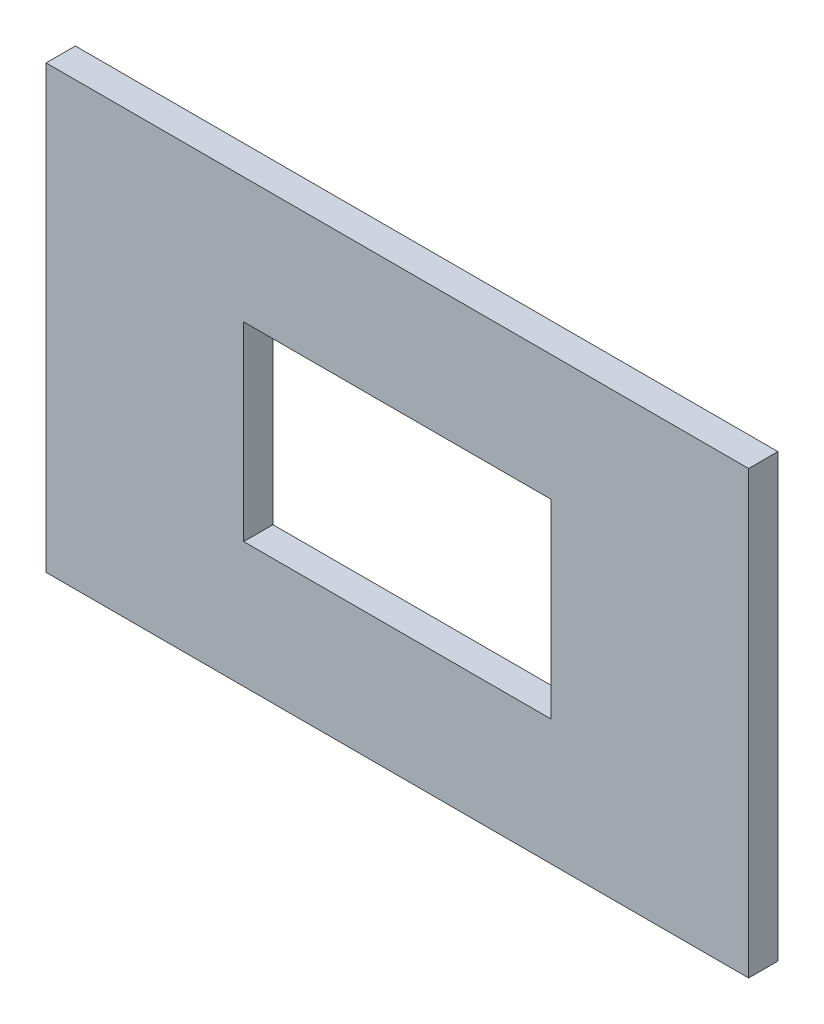
ISO-10303-21;
HEADER;
FILE_DESCRIPTION(('STEP AP214'),'2;1');
FILE_NAME('part.step','',(''),(''),'','','');
FILE_SCHEMA(('AUTOMOTIVE_DESIGN { 1 0 10303 214 1 1 1 1 }'));
ENDSEC;
DATA;
#1=APPLICATION_CONTEXT('core data for automotive mechanical design processes');
#2=APPLICATION_PROTOCOL_DEFINITION('international standard','automotive_design',2000,#1);
#3=PRODUCT_CONTEXT('',#1,'mechanical');
#4=PRODUCT('Part','Part','',(#3));
#5=PRODUCT_RELATED_PRODUCT_CATEGORY('part','',(#4));
#6=PRODUCT_DEFINITION_FORMATION('','',#4);
#7=PRODUCT_DEFINITION_CONTEXT('part definition',#1,'design');
#8=PRODUCT_DEFINITION('design','',#6,#7);
#9=PRODUCT_DEFINITION_SHAPE('','',#8);
#10=(LENGTH_UNIT() NAMED_UNIT(*) SI_UNIT(.MILLI.,.METRE.));
#11=(NAMED_UNIT(*) PLANE_ANGLE_UNIT() SI_UNIT($,.RADIAN.));
#12=(NAMED_UNIT(*) SI_UNIT($,.STERADIAN.) SOLID_ANGLE_UNIT());
#13=UNCERTAINTY_MEASURE_WITH_UNIT(LENGTH_MEASURE(1.E-05),#10,'distance_accuracy_value','');
#14=(GEOMETRIC_REPRESENTATION_CONTEXT(3) GLOBAL_UNCERTAINTY_ASSIGNED_CONTEXT((#13)) GLOBAL_UNIT_ASSIGNED_CONTEXT((#10,
#11,#12)) REPRESENTATION_CONTEXT('',''));
#15=CARTESIAN_POINT('',(0.,0.,0.));
#16=DIRECTION('',(0.,0.,1.));
#17=DIRECTION('',(1.,0.,0.));
#18=AXIS2_PLACEMENT_3D('',#15,#16,#17);
#19=CARTESIAN_POINT('',(0.,0.,10.));
#20=DIRECTION('',(0.,0.,-1.));
#21=DIRECTION('',(-1.,0.,0.));
#22=AXIS2_PLACEMENT_3D('',#19,#20,#21);
#23=PLANE('',#22);
#24=DIRECTION('',(0.,-1.,0.));
#25=VECTOR('',#24,1.);
#26=CARTESIAN_POINT('',(0.,0.,10.));
#27=LINE('',#26,#25);
#28=CARTESIAN_POINT('',(0.,150.729909,10.));
#29=VERTEX_POINT('',#28);
#30=CARTESIAN_POINT('',(0.,0.,10.));
#31=VERTEX_POINT('',#30);
#32=EDGE_CURVE('E140',#29,#31,#27,.T.);
#33=ORIENTED_EDGE('',*,*,#32,.T.);
#34=DIRECTION('',(1.,0.,0.));
#35=VECTOR('',#34,1.);
#36=CARTESIAN_POINT('',(0.,0.,10.));
#37=LINE('',#36,#35);
#38=CARTESIAN_POINT('',(240.,0.,10.));
#39=VERTEX_POINT('',#38);
#40=EDGE_CURVE('E143',#31,#39,#37,.T.);
#41=ORIENTED_EDGE('',*,*,#40,.T.);
#42=DIRECTION('',(0.,1.,0.));
#43=VECTOR('',#42,1.);
#44=CARTESIAN_POINT('',(240.,0.,10.));
#45=LINE('',#44,#43);
#46=CARTESIAN_POINT('',(240.,150.729909,10.));
#47=VERTEX_POINT('',#46);
#48=EDGE_CURVE('E146',#39,#47,#45,.T.);
#49=ORIENTED_EDGE('',*,*,#48,.T.);
#50=DIRECTION('',(-1.,0.,0.));
#51=VECTOR('',#50,1.);
#52=CARTESIAN_POINT('',(0.,150.729909,10.));
#53=LINE('',#52,#51);
#54=EDGE_CURVE('E148',#47,#29,#53,.T.);
#55=ORIENTED_EDGE('',*,*,#54,.T.);
#56=EDGE_LOOP('',(#33,#41,#49,#55));
#57=FACE_BOUND('',#56,.T.);
#58=DIRECTION('',(-1.,0.,0.));
#59=VECTOR('',#58,1.);
#60=CARTESIAN_POINT('',(67.5,107.8649545,10.));
#61=LINE('',#60,#59);
#62=CARTESIAN_POINT('',(172.5,107.8649545,10.));
#63=VERTEX_POINT('',#62);
#64=CARTESIAN_POINT('',(67.5,107.8649545,10.));
#65=VERTEX_POINT('',#64);
#66=EDGE_CURVE('E104',#63,#65,#61,.T.);
#67=ORIENTED_EDGE('',*,*,#66,.F.);
#68=DIRECTION('',(0.,1.,0.));
#69=VECTOR('',#68,1.);
#70=CARTESIAN_POINT('',(172.5,42.8649544999999,10.));
#71=LINE('',#70,#69);
#72=CARTESIAN_POINT('',(172.5,42.8649544999999,10.));
#73=VERTEX_POINT('',#72);
#74=EDGE_CURVE('E126',#73,#63,#71,.T.);
#75=ORIENTED_EDGE('',*,*,#74,.F.);
#76=DIRECTION('',(1.,0.,0.));
#77=VECTOR('',#76,1.);
#78=CARTESIAN_POINT('',(67.5,42.8649544999999,10.));
#79=LINE('',#78,#77);
#80=CARTESIAN_POINT('',(67.5,42.8649544999999,10.));
#81=VERTEX_POINT('',#80);
#82=EDGE_CURVE('E124',#81,#73,#79,.T.);
#83=ORIENTED_EDGE('',*,*,#82,.F.);
#84=DIRECTION('',(0.,-1.,0.));
#85=VECTOR('',#84,1.);
#86=CARTESIAN_POINT('',(67.5,42.8649544999999,10.));
#87=LINE('',#86,#85);
#88=EDGE_CURVE('E112',#65,#81,#87,.T.);
#89=ORIENTED_EDGE('',*,*,#88,.F.);
#90=EDGE_LOOP('',(#67,#75,#83,#89));
#91=FACE_BOUND('',#90,.T.);
#92=ADVANCED_FACE('F39',(#57,#91),#23,.F.);
#93=CARTESIAN_POINT('',(0.,0.,0.));
#94=DIRECTION('',(0.,0.,-1.));
#95=DIRECTION('',(-1.,0.,0.));
#96=AXIS2_PLACEMENT_3D('',#93,#94,#95);
#97=PLANE('',#96);
#98=DIRECTION('',(0.,-1.,0.));
#99=VECTOR('',#98,1.);
#100=CARTESIAN_POINT('',(0.,0.,0.));
#101=LINE('',#100,#99);
#102=CARTESIAN_POINT('',(0.,150.729909,0.));
#103=VERTEX_POINT('',#102);
#104=CARTESIAN_POINT('',(0.,0.,0.));
#105=VERTEX_POINT('',#104);
#106=EDGE_CURVE('E120',#103,#105,#101,.T.);
#107=ORIENTED_EDGE('',*,*,#106,.F.);
#108=DIRECTION('',(-1.,0.,0.));
#109=VECTOR('',#108,1.);
#110=CARTESIAN_POINT('',(0.,150.729909,0.));
#111=LINE('',#110,#109);
#112=CARTESIAN_POINT('',(240.,150.729909,0.));
#113=VERTEX_POINT('',#112);
#114=EDGE_CURVE('E144',#113,#103,#111,.T.);
#115=ORIENTED_EDGE('',*,*,#114,.F.);
#116=DIRECTION('',(0.,1.,0.));
#117=VECTOR('',#116,1.);
#118=CARTESIAN_POINT('',(240.,0.,0.));
#119=LINE('',#118,#117);
#120=CARTESIAN_POINT('',(240.,0.,0.));
#121=VERTEX_POINT('',#120);
#122=EDGE_CURVE('E155',#121,#113,#119,.T.);
#123=ORIENTED_EDGE('',*,*,#122,.F.);
#124=DIRECTION('',(1.,0.,0.));
#125=VECTOR('',#124,1.);
#126=CARTESIAN_POINT('',(0.,0.,0.));
#127=LINE('',#126,#125);
#128=EDGE_CURVE('E153',#105,#121,#127,.T.);
#129=ORIENTED_EDGE('',*,*,#128,.F.);
#130=EDGE_LOOP('',(#107,#115,#123,#129));
#131=FACE_BOUND('',#130,.T.);
#132=DIRECTION('',(0.,1.,0.));
#133=VECTOR('',#132,1.);
#134=CARTESIAN_POINT('',(172.5,42.8649544999999,0.));
#135=LINE('',#134,#133);
#136=CARTESIAN_POINT('',(172.5,42.8649544999999,0.));
#137=VERTEX_POINT('',#136);
#138=CARTESIAN_POINT('',(172.5,107.8649545,0.));
#139=VERTEX_POINT('',#138);
#140=EDGE_CURVE('E113',#137,#139,#135,.T.);
#141=ORIENTED_EDGE('',*,*,#140,.T.);
#142=DIRECTION('',(-1.,0.,0.));
#143=VECTOR('',#142,1.);
#144=CARTESIAN_POINT('',(67.5,107.8649545,0.));
#145=LINE('',#144,#143);
#146=CARTESIAN_POINT('',(67.5,107.8649545,0.));
#147=VERTEX_POINT('',#146);
#148=EDGE_CURVE('E62',#139,#147,#145,.T.);
#149=ORIENTED_EDGE('',*,*,#148,.T.);
#150=DIRECTION('',(0.,-1.,0.));
#151=VECTOR('',#150,1.);
#152=CARTESIAN_POINT('',(67.5,42.8649544999999,0.));
#153=LINE('',#152,#151);
#154=CARTESIAN_POINT('',(67.5,42.8649544999999,0.));
#155=VERTEX_POINT('',#154);
#156=EDGE_CURVE('E119',#147,#155,#153,.T.);
#157=ORIENTED_EDGE('',*,*,#156,.T.);
#158=DIRECTION('',(1.,0.,0.));
#159=VECTOR('',#158,1.);
#160=CARTESIAN_POINT('',(67.5,42.8649544999999,0.));
#161=LINE('',#160,#159);
#162=EDGE_CURVE('E132',#155,#137,#161,.T.);
#163=ORIENTED_EDGE('',*,*,#162,.T.);
#164=EDGE_LOOP('',(#141,#149,#157,#163));
#165=FACE_BOUND('',#164,.T.);
#166=ADVANCED_FACE('F173',(#131,#165),#97,.T.);
#167=CARTESIAN_POINT('',(0.,0.,10.));
#168=DIRECTION('',(1.,0.,0.));
#169=DIRECTION('',(0.,0.,-1.));
#170=AXIS2_PLACEMENT_3D('',#167,#168,#169);
#171=PLANE('',#170);
#172=ORIENTED_EDGE('',*,*,#106,.T.);
#173=DIRECTION('',(0.,0.,-1.));
#174=VECTOR('',#173,1.);
#175=CARTESIAN_POINT('',(0.,0.,10.));
#176=LINE('',#175,#174);
#177=EDGE_CURVE('E11',#31,#105,#176,.T.);
#178=ORIENTED_EDGE('',*,*,#177,.F.);
#179=ORIENTED_EDGE('',*,*,#32,.F.);
#180=DIRECTION('',(0.,0.,-1.));
#181=VECTOR('',#180,1.);
#182=CARTESIAN_POINT('',(0.,150.729909,10.));
#183=LINE('',#182,#181);
#184=EDGE_CURVE('E150',#29,#103,#183,.T.);
#185=ORIENTED_EDGE('',*,*,#184,.T.);
#186=EDGE_LOOP('',(#172,#178,#179,#185));
#187=FACE_BOUND('',#186,.T.);
#188=ADVANCED_FACE('F41',(#187),#171,.F.);
#189=CARTESIAN_POINT('',(0.,0.,10.));
#190=DIRECTION('',(0.,1.,0.));
#191=DIRECTION('',(0.,0.,1.));
#192=AXIS2_PLACEMENT_3D('',#189,#190,#191);
#193=PLANE('',#192);
#194=ORIENTED_EDGE('',*,*,#128,.T.);
#195=DIRECTION('',(0.,0.,-1.));
#196=VECTOR('',#195,1.);
#197=CARTESIAN_POINT('',(240.,0.,10.));
#198=LINE('',#197,#196);
#199=EDGE_CURVE('E47',#39,#121,#198,.T.);
#200=ORIENTED_EDGE('',*,*,#199,.F.);
#201=ORIENTED_EDGE('',*,*,#40,.F.);
#202=ORIENTED_EDGE('',*,*,#177,.T.);
#203=EDGE_LOOP('',(#194,#200,#201,#202));
#204=FACE_BOUND('',#203,.T.);
#205=ADVANCED_FACE('F183',(#204),#193,.F.);
#206=CARTESIAN_POINT('',(240.,0.,10.));
#207=DIRECTION('',(-1.,0.,0.));
#208=DIRECTION('',(0.,0.,1.));
#209=AXIS2_PLACEMENT_3D('',#206,#207,#208);
#210=PLANE('',#209);
#211=ORIENTED_EDGE('',*,*,#122,.T.);
#212=DIRECTION('',(0.,0.,-1.));
#213=VECTOR('',#212,1.);
#214=CARTESIAN_POINT('',(240.,150.729909,10.));
#215=LINE('',#214,#213);
#216=EDGE_CURVE('E160',#47,#113,#215,.T.);
#217=ORIENTED_EDGE('',*,*,#216,.F.);
#218=ORIENTED_EDGE('',*,*,#48,.F.);
#219=ORIENTED_EDGE('',*,*,#199,.T.);
#220=EDGE_LOOP('',(#211,#217,#218,#219));
#221=FACE_BOUND('',#220,.T.);
#222=ADVANCED_FACE('F167',(#221),#210,.F.);
#223=CARTESIAN_POINT('',(0.,150.729909,10.));
#224=DIRECTION('',(0.,-1.,0.));
#225=DIRECTION('',(0.,0.,-1.));
#226=AXIS2_PLACEMENT_3D('',#223,#224,#225);
#227=PLANE('',#226);
#228=ORIENTED_EDGE('',*,*,#114,.T.);
#229=ORIENTED_EDGE('',*,*,#184,.F.);
#230=ORIENTED_EDGE('',*,*,#54,.F.);
#231=ORIENTED_EDGE('',*,*,#216,.T.);
#232=EDGE_LOOP('',(#228,#229,#230,#231));
#233=FACE_BOUND('',#232,.T.);
#234=ADVANCED_FACE('F177',(#233),#227,.F.);
#235=CARTESIAN_POINT('',(67.5,107.8649545,10.));
#236=DIRECTION('',(0.,-1.,0.));
#237=DIRECTION('',(1.,0.,0.));
#238=AXIS2_PLACEMENT_3D('',#235,#236,#237);
#239=PLANE('',#238);
#240=ORIENTED_EDGE('',*,*,#148,.F.);
#241=DIRECTION('',(0.,0.,-1.));
#242=VECTOR('',#241,1.);
#243=CARTESIAN_POINT('',(172.5,107.8649545,10.));
#244=LINE('',#243,#242);
#245=EDGE_CURVE('E108',#63,#139,#244,.T.);
#246=ORIENTED_EDGE('',*,*,#245,.F.);
#247=ORIENTED_EDGE('',*,*,#66,.T.);
#248=DIRECTION('',(0.,0.,-1.));
#249=VECTOR('',#248,1.);
#250=CARTESIAN_POINT('',(67.5,107.8649545,10.));
#251=LINE('',#250,#249);
#252=EDGE_CURVE('E107',#65,#147,#251,.T.);
#253=ORIENTED_EDGE('',*,*,#252,.T.);
#254=EDGE_LOOP('',(#240,#246,#247,#253));
#255=FACE_BOUND('',#254,.T.);
#256=ADVANCED_FACE('F106',(#255),#239,.T.);
#257=CARTESIAN_POINT('',(67.5,42.8649544999999,10.));
#258=DIRECTION('',(1.,0.,0.));
#259=DIRECTION('',(0.,1.,0.));
#260=AXIS2_PLACEMENT_3D('',#257,#258,#259);
#261=PLANE('',#260);
#262=ORIENTED_EDGE('',*,*,#156,.F.);
#263=ORIENTED_EDGE('',*,*,#252,.F.);
#264=ORIENTED_EDGE('',*,*,#88,.T.);
#265=DIRECTION('',(0.,0.,-1.));
#266=VECTOR('',#265,1.);
#267=CARTESIAN_POINT('',(67.5,42.8649544999999,10.));
#268=LINE('',#267,#266);
#269=EDGE_CURVE('E121',#81,#155,#268,.T.);
#270=ORIENTED_EDGE('',*,*,#269,.T.);
#271=EDGE_LOOP('',(#262,#263,#264,#270));
#272=FACE_BOUND('',#271,.T.);
#273=ADVANCED_FACE('F116',(#272),#261,.T.);
#274=CARTESIAN_POINT('',(67.5,42.8649544999999,10.));
#275=DIRECTION('',(0.,1.,0.));
#276=DIRECTION('',(0.,0.,1.));
#277=AXIS2_PLACEMENT_3D('',#274,#275,#276);
#278=PLANE('',#277);
#279=ORIENTED_EDGE('',*,*,#162,.F.);
#280=ORIENTED_EDGE('',*,*,#269,.F.);
#281=ORIENTED_EDGE('',*,*,#82,.T.);
#282=DIRECTION('',(0.,0.,-1.));
#283=VECTOR('',#282,1.);
#284=CARTESIAN_POINT('',(172.5,42.8649544999999,10.));
#285=LINE('',#284,#283);
#286=EDGE_CURVE('E54',#73,#137,#285,.T.);
#287=ORIENTED_EDGE('',*,*,#286,.T.);
#288=EDGE_LOOP('',(#279,#280,#281,#287));
#289=FACE_BOUND('',#288,.T.);
#290=ADVANCED_FACE('F206',(#289),#278,.T.);
#291=CARTESIAN_POINT('',(172.5,42.8649544999999,10.));
#292=DIRECTION('',(-1.,0.,0.));
#293=DIRECTION('',(0.,0.,1.));
#294=AXIS2_PLACEMENT_3D('',#291,#292,#293);
#295=PLANE('',#294);
#296=ORIENTED_EDGE('',*,*,#140,.F.);
#297=ORIENTED_EDGE('',*,*,#286,.F.);
#298=ORIENTED_EDGE('',*,*,#74,.T.);
#299=ORIENTED_EDGE('',*,*,#245,.T.);
#300=EDGE_LOOP('',(#296,#297,#298,#299));
#301=FACE_BOUND('',#300,.T.);
#302=ADVANCED_FACE('F210',(#301),#295,.T.);
#303=CLOSED_SHELL('',(#92,#166,#188,#205,#222,#234,#256,#273,#290,#302));
#304=MANIFOLD_SOLID_BREP('B2',#303);
#305=ADVANCED_BREP_SHAPE_REPRESENTATION('',(#18,#304),#14);
#306=SHAPE_DEFINITION_REPRESENTATION(#9,#305);
ENDSEC;
END-ISO-10303-21;
